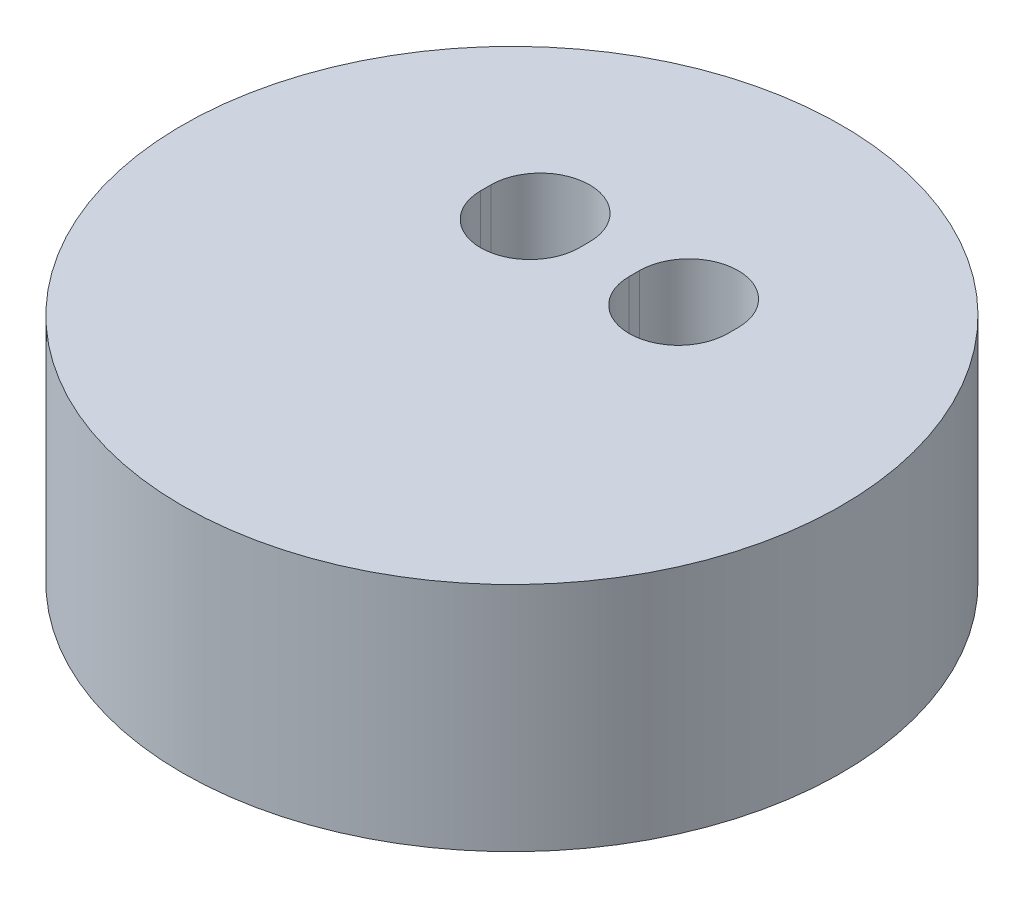
ISO-10303-21;
HEADER;
FILE_DESCRIPTION(('STEP AP214'),'2;1');
FILE_NAME('part.step','',(''),(''),'','','');
FILE_SCHEMA(('AUTOMOTIVE_DESIGN { 1 0 10303 214 1 1 1 1 }'));
ENDSEC;
DATA;
#1=APPLICATION_CONTEXT('core data for automotive mechanical design processes');
#2=APPLICATION_PROTOCOL_DEFINITION('international standard','automotive_design',2000,#1);
#3=PRODUCT_CONTEXT('',#1,'mechanical');
#4=PRODUCT('Part','Part','',(#3));
#5=PRODUCT_RELATED_PRODUCT_CATEGORY('part','',(#4));
#6=PRODUCT_DEFINITION_FORMATION('','',#4);
#7=PRODUCT_DEFINITION_CONTEXT('part definition',#1,'design');
#8=PRODUCT_DEFINITION('design','',#6,#7);
#9=PRODUCT_DEFINITION_SHAPE('','',#8);
#10=(LENGTH_UNIT() NAMED_UNIT(*) SI_UNIT(.MILLI.,.METRE.));
#11=(NAMED_UNIT(*) PLANE_ANGLE_UNIT() SI_UNIT($,.RADIAN.));
#12=(NAMED_UNIT(*) SI_UNIT($,.STERADIAN.) SOLID_ANGLE_UNIT());
#13=UNCERTAINTY_MEASURE_WITH_UNIT(LENGTH_MEASURE(1.E-05),#10,'distance_accuracy_value','');
#14=(GEOMETRIC_REPRESENTATION_CONTEXT(3) GLOBAL_UNCERTAINTY_ASSIGNED_CONTEXT((#13)) GLOBAL_UNIT_ASSIGNED_CONTEXT((#10,
#11,#12)) REPRESENTATION_CONTEXT('',''));
#15=CARTESIAN_POINT('',(0.,0.,0.));
#16=DIRECTION('',(0.,0.,1.));
#17=DIRECTION('',(1.,0.,0.));
#18=AXIS2_PLACEMENT_3D('',#15,#16,#17);
#19=CARTESIAN_POINT('',(0.,8.678,0.));
#20=DIRECTION('',(0.,-1.,0.));
#21=DIRECTION('',(0.,0.,-1.));
#22=AXIS2_PLACEMENT_3D('',#19,#20,#21);
#23=CYLINDRICAL_SURFACE('',#22,12.36);
#24=CARTESIAN_POINT('',(0.,8.678,0.));
#25=DIRECTION('',(0.,1.,0.));
#26=DIRECTION('',(0.,0.,1.));
#27=AXIS2_PLACEMENT_3D('',#24,#25,#26);
#28=CIRCLE('',#27,12.36);
#29=CARTESIAN_POINT('',(0.,8.678,12.36));
#30=VERTEX_POINT('',#29);
#31=EDGE_CURVE('E11',#30,#30,#28,.T.);
#32=ORIENTED_EDGE('',*,*,#31,.F.);
#33=EDGE_LOOP('',(#32));
#34=FACE_BOUND('',#33,.T.);
#35=CARTESIAN_POINT('',(0.,0.,0.));
#36=DIRECTION('',(0.,1.,0.));
#37=DIRECTION('',(0.,0.,1.));
#38=AXIS2_PLACEMENT_3D('',#35,#36,#37);
#39=CIRCLE('',#38,12.36);
#40=CARTESIAN_POINT('',(0.,0.,12.36));
#41=VERTEX_POINT('',#40);
#42=EDGE_CURVE('E46',#41,#41,#39,.T.);
#43=ORIENTED_EDGE('',*,*,#42,.T.);
#44=EDGE_LOOP('',(#43));
#45=FACE_BOUND('',#44,.T.);
#46=ADVANCED_FACE('F43',(#34,#45),#23,.T.);
#47=CARTESIAN_POINT('',(0.,8.678,0.));
#48=DIRECTION('',(0.,1.,0.));
#49=DIRECTION('',(0.,0.,1.));
#50=AXIS2_PLACEMENT_3D('',#47,#48,#49);
#51=PLANE('',#50);
#52=CARTESIAN_POINT('',(-2.785,8.678,-3.85));
#53=DIRECTION('',(0.,1.,0.));
#54=DIRECTION('',(0.,0.,1.));
#55=AXIS2_PLACEMENT_3D('',#52,#53,#54);
#56=CIRCLE('',#55,1.85);
#57=CARTESIAN_POINT('',(-0.935000000000001,8.678,-3.85));
#58=VERTEX_POINT('',#57);
#59=CARTESIAN_POINT('',(-4.635,8.678,-3.85));
#60=VERTEX_POINT('',#59);
#61=EDGE_CURVE('E58',#58,#60,#56,.T.);
#62=ORIENTED_EDGE('',*,*,#61,.F.);
#63=DIRECTION('',(0.,0.,-1.));
#64=VECTOR('',#63,1.);
#65=CARTESIAN_POINT('',(-0.935000000000001,8.678,-3.85));
#66=LINE('',#65,#64);
#67=CARTESIAN_POINT('',(-0.935000000000001,8.678,-3.46000000000001));
#68=VERTEX_POINT('',#67);
#69=EDGE_CURVE('E132',#68,#58,#66,.T.);
#70=ORIENTED_EDGE('',*,*,#69,.F.);
#71=CARTESIAN_POINT('',(-2.785,8.678,-3.46));
#72=DIRECTION('',(0.,1.,0.));
#73=DIRECTION('',(0.,0.,1.));
#74=AXIS2_PLACEMENT_3D('',#71,#72,#73);
#75=CIRCLE('',#74,1.85);
#76=CARTESIAN_POINT('',(-4.635,8.678,-3.46));
#77=VERTEX_POINT('',#76);
#78=EDGE_CURVE('E136',#77,#68,#75,.T.);
#79=ORIENTED_EDGE('',*,*,#78,.F.);
#80=DIRECTION('',(0.,0.,1.));
#81=VECTOR('',#80,1.);
#82=CARTESIAN_POINT('',(-4.635,8.678,-3.85));
#83=LINE('',#82,#81);
#84=EDGE_CURVE('E145',#60,#77,#83,.T.);
#85=ORIENTED_EDGE('',*,*,#84,.F.);
#86=EDGE_LOOP('',(#62,#70,#79,#85));
#87=FACE_BOUND('',#86,.T.);
#88=CARTESIAN_POINT('',(2.785,8.678,-3.85));
#89=DIRECTION('',(0.,1.,0.));
#90=DIRECTION('',(0.,0.,1.));
#91=AXIS2_PLACEMENT_3D('',#88,#89,#90);
#92=CIRCLE('',#91,1.85);
#93=CARTESIAN_POINT('',(4.635,8.678,-3.85));
#94=VERTEX_POINT('',#93);
#95=CARTESIAN_POINT('',(0.934999999999997,8.678,-3.85));
#96=VERTEX_POINT('',#95);
#97=EDGE_CURVE('E66',#94,#96,#92,.T.);
#98=ORIENTED_EDGE('',*,*,#97,.F.);
#99=DIRECTION('',(0.,0.,-1.));
#100=VECTOR('',#99,1.);
#101=CARTESIAN_POINT('',(4.635,8.678,-3.85));
#102=LINE('',#101,#100);
#103=CARTESIAN_POINT('',(4.635,8.678,-3.46));
#104=VERTEX_POINT('',#103);
#105=EDGE_CURVE('E172',#104,#94,#102,.T.);
#106=ORIENTED_EDGE('',*,*,#105,.F.);
#107=CARTESIAN_POINT('',(2.785,8.678,-3.46));
#108=DIRECTION('',(0.,1.,0.));
#109=DIRECTION('',(0.,0.,1.));
#110=AXIS2_PLACEMENT_3D('',#107,#108,#109);
#111=CIRCLE('',#110,1.85);
#112=CARTESIAN_POINT('',(0.934999999999996,8.678,-3.46));
#113=VERTEX_POINT('',#112);
#114=EDGE_CURVE('E176',#113,#104,#111,.T.);
#115=ORIENTED_EDGE('',*,*,#114,.F.);
#116=DIRECTION('',(0.,0.,1.));
#117=VECTOR('',#116,1.);
#118=CARTESIAN_POINT('',(0.934999999999997,8.678,-3.85));
#119=LINE('',#118,#117);
#120=EDGE_CURVE('E181',#96,#113,#119,.T.);
#121=ORIENTED_EDGE('',*,*,#120,.F.);
#122=EDGE_LOOP('',(#98,#106,#115,#121));
#123=FACE_BOUND('',#122,.T.);
#124=ORIENTED_EDGE('',*,*,#31,.T.);
#125=EDGE_LOOP('',(#124));
#126=FACE_BOUND('',#125,.T.);
#127=ADVANCED_FACE('F216',(#87,#123,#126),#51,.T.);
#128=CARTESIAN_POINT('',(0.,0.,0.));
#129=DIRECTION('',(0.,1.,0.));
#130=DIRECTION('',(0.,0.,1.));
#131=AXIS2_PLACEMENT_3D('',#128,#129,#130);
#132=PLANE('',#131);
#133=DIRECTION('',(0.,0.,-1.));
#134=VECTOR('',#133,1.);
#135=CARTESIAN_POINT('',(-0.935000000000001,0.,-3.85));
#136=LINE('',#135,#134);
#137=CARTESIAN_POINT('',(-0.935000000000001,0.,-3.46000000000001));
#138=VERTEX_POINT('',#137);
#139=CARTESIAN_POINT('',(-0.935000000000001,0.,-3.85));
#140=VERTEX_POINT('',#139);
#141=EDGE_CURVE('E117',#138,#140,#136,.T.);
#142=ORIENTED_EDGE('',*,*,#141,.T.);
#143=CARTESIAN_POINT('',(-2.785,0.,-3.85));
#144=DIRECTION('',(0.,1.,0.));
#145=DIRECTION('',(0.,0.,1.));
#146=AXIS2_PLACEMENT_3D('',#143,#144,#145);
#147=CIRCLE('',#146,1.85);
#148=CARTESIAN_POINT('',(-4.635,0.,-3.85));
#149=VERTEX_POINT('',#148);
#150=EDGE_CURVE('E110',#140,#149,#147,.T.);
#151=ORIENTED_EDGE('',*,*,#150,.T.);
#152=DIRECTION('',(0.,0.,1.));
#153=VECTOR('',#152,1.);
#154=CARTESIAN_POINT('',(-4.635,0.,-3.85));
#155=LINE('',#154,#153);
#156=CARTESIAN_POINT('',(-4.635,0.,-3.46));
#157=VERTEX_POINT('',#156);
#158=EDGE_CURVE('E121',#149,#157,#155,.T.);
#159=ORIENTED_EDGE('',*,*,#158,.T.);
#160=CARTESIAN_POINT('',(-2.785,0.,-3.46));
#161=DIRECTION('',(0.,1.,0.));
#162=DIRECTION('',(0.,0.,1.));
#163=AXIS2_PLACEMENT_3D('',#160,#161,#162);
#164=CIRCLE('',#163,1.85);
#165=EDGE_CURVE('E126',#157,#138,#164,.T.);
#166=ORIENTED_EDGE('',*,*,#165,.T.);
#167=EDGE_LOOP('',(#142,#151,#159,#166));
#168=FACE_BOUND('',#167,.T.);
#169=DIRECTION('',(0.,0.,-1.));
#170=VECTOR('',#169,1.);
#171=CARTESIAN_POINT('',(4.635,0.,-3.85));
#172=LINE('',#171,#170);
#173=CARTESIAN_POINT('',(4.635,0.,-3.46));
#174=VERTEX_POINT('',#173);
#175=CARTESIAN_POINT('',(4.635,0.,-3.85));
#176=VERTEX_POINT('',#175);
#177=EDGE_CURVE('E162',#174,#176,#172,.T.);
#178=ORIENTED_EDGE('',*,*,#177,.T.);
#179=CARTESIAN_POINT('',(2.785,0.,-3.85));
#180=DIRECTION('',(0.,1.,0.));
#181=DIRECTION('',(0.,0.,1.));
#182=AXIS2_PLACEMENT_3D('',#179,#180,#181);
#183=CIRCLE('',#182,1.85);
#184=CARTESIAN_POINT('',(0.934999999999997,0.,-3.85));
#185=VERTEX_POINT('',#184);
#186=EDGE_CURVE('E177',#176,#185,#183,.T.);
#187=ORIENTED_EDGE('',*,*,#186,.T.);
#188=DIRECTION('',(0.,0.,1.));
#189=VECTOR('',#188,1.);
#190=CARTESIAN_POINT('',(0.934999999999997,0.,-3.85));
#191=LINE('',#190,#189);
#192=CARTESIAN_POINT('',(0.934999999999997,0.,-3.46));
#193=VERTEX_POINT('',#192);
#194=EDGE_CURVE('E194',#185,#193,#191,.T.);
#195=ORIENTED_EDGE('',*,*,#194,.T.);
#196=CARTESIAN_POINT('',(2.785,0.,-3.46));
#197=DIRECTION('',(0.,1.,0.));
#198=DIRECTION('',(0.,0.,1.));
#199=AXIS2_PLACEMENT_3D('',#196,#197,#198);
#200=CIRCLE('',#199,1.85);
#201=EDGE_CURVE('E190',#193,#174,#200,.T.);
#202=ORIENTED_EDGE('',*,*,#201,.T.);
#203=EDGE_LOOP('',(#178,#187,#195,#202));
#204=FACE_BOUND('',#203,.T.);
#205=ORIENTED_EDGE('',*,*,#42,.F.);
#206=EDGE_LOOP('',(#205));
#207=FACE_BOUND('',#206,.T.);
#208=ADVANCED_FACE('F128',(#168,#204,#207),#132,.F.);
#209=CARTESIAN_POINT('',(2.785,0.,-3.85));
#210=DIRECTION('',(0.,1.,0.));
#211=DIRECTION('',(0.,0.,1.));
#212=AXIS2_PLACEMENT_3D('',#209,#210,#211);
#213=CYLINDRICAL_SURFACE('',#212,1.85);
#214=ORIENTED_EDGE('',*,*,#97,.T.);
#215=DIRECTION('',(0.,1.,0.));
#216=VECTOR('',#215,1.);
#217=CARTESIAN_POINT('',(0.934999999999997,0.,-3.85));
#218=LINE('',#217,#216);
#219=EDGE_CURVE('E159',#185,#96,#218,.T.);
#220=ORIENTED_EDGE('',*,*,#219,.F.);
#221=ORIENTED_EDGE('',*,*,#186,.F.);
#222=DIRECTION('',(0.,1.,0.));
#223=VECTOR('',#222,1.);
#224=CARTESIAN_POINT('',(4.635,0.,-3.85));
#225=LINE('',#224,#223);
#226=EDGE_CURVE('E169',#176,#94,#225,.T.);
#227=ORIENTED_EDGE('',*,*,#226,.T.);
#228=EDGE_LOOP('',(#214,#220,#221,#227));
#229=FACE_BOUND('',#228,.T.);
#230=ADVANCED_FACE('F204',(#229),#213,.F.);
#231=CARTESIAN_POINT('',(4.635,0.,-3.85));
#232=DIRECTION('',(1.,0.,0.));
#233=DIRECTION('',(0.,0.,-1.));
#234=AXIS2_PLACEMENT_3D('',#231,#232,#233);
#235=PLANE('',#234);
#236=ORIENTED_EDGE('',*,*,#105,.T.);
#237=ORIENTED_EDGE('',*,*,#226,.F.);
#238=ORIENTED_EDGE('',*,*,#177,.F.);
#239=DIRECTION('',(0.,1.,0.));
#240=VECTOR('',#239,1.);
#241=CARTESIAN_POINT('',(4.635,0.,-3.46));
#242=LINE('',#241,#240);
#243=EDGE_CURVE('E166',#174,#104,#242,.T.);
#244=ORIENTED_EDGE('',*,*,#243,.T.);
#245=EDGE_LOOP('',(#236,#237,#238,#244));
#246=FACE_BOUND('',#245,.T.);
#247=ADVANCED_FACE('F214',(#246),#235,.F.);
#248=CARTESIAN_POINT('',(2.785,0.,-3.46));
#249=DIRECTION('',(0.,1.,0.));
#250=DIRECTION('',(0.,0.,1.));
#251=AXIS2_PLACEMENT_3D('',#248,#249,#250);
#252=CYLINDRICAL_SURFACE('',#251,1.85);
#253=ORIENTED_EDGE('',*,*,#114,.T.);
#254=ORIENTED_EDGE('',*,*,#243,.F.);
#255=ORIENTED_EDGE('',*,*,#201,.F.);
#256=DIRECTION('',(0.,1.,0.));
#257=VECTOR('',#256,1.);
#258=CARTESIAN_POINT('',(0.934999999999996,0.,-3.46));
#259=LINE('',#258,#257);
#260=EDGE_CURVE('E163',#193,#113,#259,.T.);
#261=ORIENTED_EDGE('',*,*,#260,.T.);
#262=EDGE_LOOP('',(#253,#254,#255,#261));
#263=FACE_BOUND('',#262,.T.);
#264=ADVANCED_FACE('F211',(#263),#252,.F.);
#265=CARTESIAN_POINT('',(0.934999999999997,0.,-3.85));
#266=DIRECTION('',(-1.,0.,0.));
#267=DIRECTION('',(0.,0.,1.));
#268=AXIS2_PLACEMENT_3D('',#265,#266,#267);
#269=PLANE('',#268);
#270=ORIENTED_EDGE('',*,*,#120,.T.);
#271=ORIENTED_EDGE('',*,*,#260,.F.);
#272=ORIENTED_EDGE('',*,*,#194,.F.);
#273=ORIENTED_EDGE('',*,*,#219,.T.);
#274=EDGE_LOOP('',(#270,#271,#272,#273));
#275=FACE_BOUND('',#274,.T.);
#276=ADVANCED_FACE('F208',(#275),#269,.F.);
#277=CARTESIAN_POINT('',(-2.785,0.,-3.85));
#278=DIRECTION('',(0.,1.,0.));
#279=DIRECTION('',(0.,0.,1.));
#280=AXIS2_PLACEMENT_3D('',#277,#278,#279);
#281=CYLINDRICAL_SURFACE('',#280,1.85);
#282=ORIENTED_EDGE('',*,*,#61,.T.);
#283=DIRECTION('',(0.,1.,0.));
#284=VECTOR('',#283,1.);
#285=CARTESIAN_POINT('',(-4.635,0.,-3.85));
#286=LINE('',#285,#284);
#287=EDGE_CURVE('E106',#149,#60,#286,.T.);
#288=ORIENTED_EDGE('',*,*,#287,.F.);
#289=ORIENTED_EDGE('',*,*,#150,.F.);
#290=DIRECTION('',(0.,1.,0.));
#291=VECTOR('',#290,1.);
#292=CARTESIAN_POINT('',(-0.935000000000001,0.,-3.85));
#293=LINE('',#292,#291);
#294=EDGE_CURVE('E151',#140,#58,#293,.T.);
#295=ORIENTED_EDGE('',*,*,#294,.T.);
#296=EDGE_LOOP('',(#282,#288,#289,#295));
#297=FACE_BOUND('',#296,.T.);
#298=ADVANCED_FACE('F108',(#297),#281,.F.);
#299=CARTESIAN_POINT('',(-0.935000000000001,0.,-3.85));
#300=DIRECTION('',(1.,0.,0.));
#301=DIRECTION('',(0.,0.,-1.));
#302=AXIS2_PLACEMENT_3D('',#299,#300,#301);
#303=PLANE('',#302);
#304=ORIENTED_EDGE('',*,*,#69,.T.);
#305=ORIENTED_EDGE('',*,*,#294,.F.);
#306=ORIENTED_EDGE('',*,*,#141,.F.);
#307=DIRECTION('',(0.,1.,0.));
#308=VECTOR('',#307,1.);
#309=CARTESIAN_POINT('',(-0.935000000000001,0.,-3.46000000000001));
#310=LINE('',#309,#308);
#311=EDGE_CURVE('E154',#138,#68,#310,.T.);
#312=ORIENTED_EDGE('',*,*,#311,.T.);
#313=EDGE_LOOP('',(#304,#305,#306,#312));
#314=FACE_BOUND('',#313,.T.);
#315=ADVANCED_FACE('F242',(#314),#303,.F.);
#316=CARTESIAN_POINT('',(-2.785,0.,-3.46));
#317=DIRECTION('',(0.,1.,0.));
#318=DIRECTION('',(0.,0.,1.));
#319=AXIS2_PLACEMENT_3D('',#316,#317,#318);
#320=CYLINDRICAL_SURFACE('',#319,1.85);
#321=ORIENTED_EDGE('',*,*,#78,.T.);
#322=ORIENTED_EDGE('',*,*,#311,.F.);
#323=ORIENTED_EDGE('',*,*,#165,.F.);
#324=DIRECTION('',(0.,1.,0.));
#325=VECTOR('',#324,1.);
#326=CARTESIAN_POINT('',(-4.635,0.,-3.46));
#327=LINE('',#326,#325);
#328=EDGE_CURVE('E116',#157,#77,#327,.T.);
#329=ORIENTED_EDGE('',*,*,#328,.T.);
#330=EDGE_LOOP('',(#321,#322,#323,#329));
#331=FACE_BOUND('',#330,.T.);
#332=ADVANCED_FACE('F245',(#331),#320,.F.);
#333=CARTESIAN_POINT('',(-4.635,0.,-3.85));
#334=DIRECTION('',(-1.,0.,0.));
#335=DIRECTION('',(0.,0.,1.));
#336=AXIS2_PLACEMENT_3D('',#333,#334,#335);
#337=PLANE('',#336);
#338=ORIENTED_EDGE('',*,*,#84,.T.);
#339=ORIENTED_EDGE('',*,*,#328,.F.);
#340=ORIENTED_EDGE('',*,*,#158,.F.);
#341=ORIENTED_EDGE('',*,*,#287,.T.);
#342=EDGE_LOOP('',(#338,#339,#340,#341));
#343=FACE_BOUND('',#342,.T.);
#344=ADVANCED_FACE('F122',(#343),#337,.F.);
#345=CLOSED_SHELL('',(#46,#127,#208,#230,#247,#264,#276,#298,#315,#332,#344));
#346=MANIFOLD_SOLID_BREP('B2',#345);
#347=ADVANCED_BREP_SHAPE_REPRESENTATION('',(#18,#346),#14);
#348=SHAPE_DEFINITION_REPRESENTATION(#9,#347);
ENDSEC;
END-ISO-10303-21;
